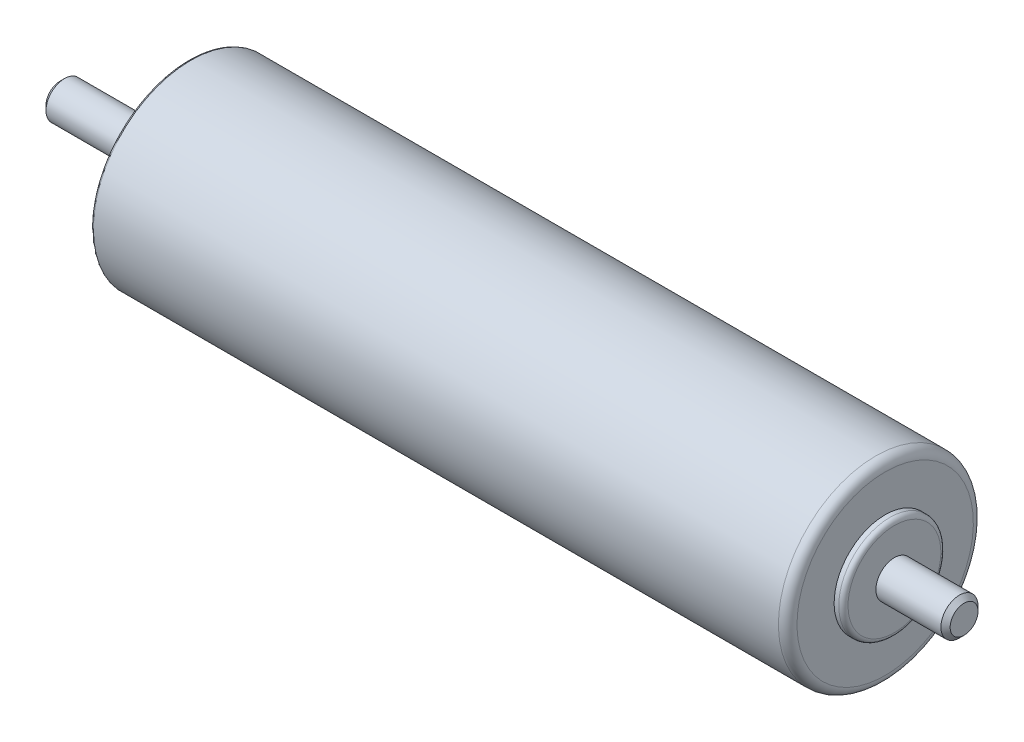
ISO-10303-21;
HEADER;
FILE_DESCRIPTION(('STEP AP214'),'2;1');
FILE_NAME('part.step','',(''),(''),'','','');
FILE_SCHEMA(('AUTOMOTIVE_DESIGN { 1 0 10303 214 1 1 1 1 }'));
ENDSEC;
DATA;
#1=APPLICATION_CONTEXT('core data for automotive mechanical design processes');
#2=APPLICATION_PROTOCOL_DEFINITION('international standard','automotive_design',2000,#1);
#3=PRODUCT_CONTEXT('',#1,'mechanical');
#4=PRODUCT('Part','Part','',(#3));
#5=PRODUCT_RELATED_PRODUCT_CATEGORY('part','',(#4));
#6=PRODUCT_DEFINITION_FORMATION('','',#4);
#7=PRODUCT_DEFINITION_CONTEXT('part definition',#1,'design');
#8=PRODUCT_DEFINITION('design','',#6,#7);
#9=PRODUCT_DEFINITION_SHAPE('','',#8);
#10=(LENGTH_UNIT() NAMED_UNIT(*) SI_UNIT(.MILLI.,.METRE.));
#11=(NAMED_UNIT(*) PLANE_ANGLE_UNIT() SI_UNIT($,.RADIAN.));
#12=(NAMED_UNIT(*) SI_UNIT($,.STERADIAN.) SOLID_ANGLE_UNIT());
#13=UNCERTAINTY_MEASURE_WITH_UNIT(LENGTH_MEASURE(1.E-05),#10,'distance_accuracy_value','');
#14=(GEOMETRIC_REPRESENTATION_CONTEXT(3) GLOBAL_UNCERTAINTY_ASSIGNED_CONTEXT((#13)) GLOBAL_UNIT_ASSIGNED_CONTEXT((#10,
#11,#12)) REPRESENTATION_CONTEXT('',''));
#15=CARTESIAN_POINT('',(0.,0.,0.));
#16=DIRECTION('',(0.,0.,1.));
#17=DIRECTION('',(1.,0.,0.));
#18=AXIS2_PLACEMENT_3D('',#15,#16,#17);
#19=CARTESIAN_POINT('',(0.,0.,0.));
#20=DIRECTION('',(-1.,0.,0.));
#21=DIRECTION('',(0.,-1.,0.));
#22=AXIS2_PLACEMENT_3D('',#19,#20,#21);
#23=PLANE('',#22);
#24=CARTESIAN_POINT('',(0.,0.,0.));
#25=DIRECTION('',(-1.,0.,0.));
#26=DIRECTION('',(0.,-1.,0.));
#27=AXIS2_PLACEMENT_3D('',#24,#25,#26);
#28=CIRCLE('',#27,3.);
#29=CARTESIAN_POINT('',(0.,-3.,0.));
#30=VERTEX_POINT('',#29);
#31=EDGE_CURVE('E159',#30,#30,#28,.T.);
#32=ORIENTED_EDGE('',*,*,#31,.T.);
#33=EDGE_LOOP('',(#32));
#34=FACE_BOUND('',#33,.T.);
#35=ADVANCED_FACE('F36',(#34),#23,.T.);
#36=CARTESIAN_POINT('',(194.8,0.,0.));
#37=DIRECTION('',(1.,0.,0.));
#38=DIRECTION('',(0.,1.,0.));
#39=AXIS2_PLACEMENT_3D('',#36,#37,#38);
#40=CYLINDRICAL_SURFACE('',#39,3.99999999999998);
#41=CARTESIAN_POINT('',(0.999999999999945,0.,0.));
#42=DIRECTION('',(-1.,0.,0.));
#43=DIRECTION('',(0.,-1.,0.));
#44=AXIS2_PLACEMENT_3D('',#41,#42,#43);
#45=CIRCLE('',#44,3.99999999999998);
#46=CARTESIAN_POINT('',(0.999999999999946,-3.99999999999998,0.));
#47=VERTEX_POINT('',#46);
#48=EDGE_CURVE('E156',#47,#47,#45,.F.);
#49=ORIENTED_EDGE('',*,*,#48,.T.);
#50=EDGE_LOOP('',(#49));
#51=FACE_BOUND('',#50,.T.);
#52=CARTESIAN_POINT('',(25.,0.,0.));
#53=DIRECTION('',(1.,0.,0.));
#54=DIRECTION('',(0.,1.,0.));
#55=AXIS2_PLACEMENT_3D('',#52,#53,#54);
#56=CIRCLE('',#55,3.99999999999997);
#57=CARTESIAN_POINT('',(25.,3.99999999999998,0.));
#58=VERTEX_POINT('',#57);
#59=EDGE_CURVE('E135',#58,#58,#56,.T.);
#60=ORIENTED_EDGE('',*,*,#59,.F.);
#61=EDGE_LOOP('',(#60));
#62=FACE_BOUND('',#61,.T.);
#63=ADVANCED_FACE('F189',(#51,#62),#40,.T.);
#64=CARTESIAN_POINT('',(25.,3.99999999999998,0.));
#65=DIRECTION('',(-1.,0.,0.));
#66=DIRECTION('',(0.,-1.,0.));
#67=AXIS2_PLACEMENT_3D('',#64,#65,#66);
#68=PLANE('',#67);
#69=CARTESIAN_POINT('',(25.,0.,0.));
#70=DIRECTION('',(-1.,0.,0.));
#71=DIRECTION('',(0.,-1.,0.));
#72=AXIS2_PLACEMENT_3D('',#69,#70,#71);
#73=CIRCLE('',#72,11.5);
#74=CARTESIAN_POINT('',(25.,-11.5,0.));
#75=VERTEX_POINT('',#74);
#76=EDGE_CURVE('E147',#75,#75,#73,.T.);
#77=ORIENTED_EDGE('',*,*,#76,.T.);
#78=EDGE_LOOP('',(#77));
#79=FACE_BOUND('',#78,.T.);
#80=ORIENTED_EDGE('',*,*,#59,.T.);
#81=EDGE_LOOP('',(#80));
#82=FACE_BOUND('',#81,.T.);
#83=ADVANCED_FACE('F195',(#79,#82),#68,.T.);
#84=CARTESIAN_POINT('',(194.8,0.,0.));
#85=DIRECTION('',(1.,0.,0.));
#86=DIRECTION('',(0.,1.,0.));
#87=AXIS2_PLACEMENT_3D('',#84,#85,#86);
#88=CYLINDRICAL_SURFACE('',#87,12.5);
#89=CARTESIAN_POINT('',(26.,0.,0.));
#90=DIRECTION('',(-1.,0.,0.));
#91=DIRECTION('',(0.,-1.,0.));
#92=AXIS2_PLACEMENT_3D('',#89,#90,#91);
#93=CIRCLE('',#92,12.5);
#94=CARTESIAN_POINT('',(26.,-12.5,0.));
#95=VERTEX_POINT('',#94);
#96=EDGE_CURVE('E144',#95,#95,#93,.F.);
#97=ORIENTED_EDGE('',*,*,#96,.T.);
#98=EDGE_LOOP('',(#97));
#99=FACE_BOUND('',#98,.T.);
#100=CARTESIAN_POINT('',(27.8,0.,0.));
#101=DIRECTION('',(1.,0.,0.));
#102=DIRECTION('',(0.,1.,0.));
#103=AXIS2_PLACEMENT_3D('',#100,#101,#102);
#104=CIRCLE('',#103,12.5);
#105=CARTESIAN_POINT('',(27.8,12.5,0.));
#106=VERTEX_POINT('',#105);
#107=EDGE_CURVE('E132',#106,#106,#104,.T.);
#108=ORIENTED_EDGE('',*,*,#107,.F.);
#109=EDGE_LOOP('',(#108));
#110=FACE_BOUND('',#109,.T.);
#111=ADVANCED_FACE('F256',(#99,#110),#88,.T.);
#112=CARTESIAN_POINT('',(27.8,12.5,0.));
#113=DIRECTION('',(-1.,0.,0.));
#114=DIRECTION('',(0.,-1.,0.));
#115=AXIS2_PLACEMENT_3D('',#112,#113,#114);
#116=PLANE('',#115);
#117=CARTESIAN_POINT('',(27.8,12.5289813198397,12.9238007988017));
#118=DIRECTION('',(-1.,0.,0.));
#119=DIRECTION('',(0.,0.,1.));
#120=AXIS2_PLACEMENT_3D('',#117,#118,#119);
#121=CIRCLE('',#120,1.64999999999999);
#122=CARTESIAN_POINT('',(27.8,12.5289813198397,14.5738007988017));
#123=VERTEX_POINT('',#122);
#124=EDGE_CURVE('E80',#123,#123,#121,.T.);
#125=ORIENTED_EDGE('',*,*,#124,.F.);
#126=EDGE_LOOP('',(#125));
#127=FACE_BOUND('',#126,.T.);
#128=CARTESIAN_POINT('',(27.8,12.9238007988016,-12.5289813198398));
#129=DIRECTION('',(-1.,0.,0.));
#130=DIRECTION('',(0.,0.,1.));
#131=AXIS2_PLACEMENT_3D('',#128,#129,#130);
#132=CIRCLE('',#131,1.64999999999999);
#133=CARTESIAN_POINT('',(27.8,12.9238007988016,-10.8789813198398));
#134=VERTEX_POINT('',#133);
#135=EDGE_CURVE('E79',#134,#134,#132,.T.);
#136=ORIENTED_EDGE('',*,*,#135,.F.);
#137=EDGE_LOOP('',(#136));
#138=FACE_BOUND('',#137,.T.);
#139=CARTESIAN_POINT('',(27.8,-12.5289813198398,-12.9238007988016));
#140=DIRECTION('',(-1.,0.,0.));
#141=DIRECTION('',(0.,0.,1.));
#142=AXIS2_PLACEMENT_3D('',#139,#140,#141);
#143=CIRCLE('',#142,1.64999999999999);
#144=CARTESIAN_POINT('',(27.8,-12.5289813198398,-11.2738007988016));
#145=VERTEX_POINT('',#144);
#146=EDGE_CURVE('E90',#145,#145,#143,.T.);
#147=ORIENTED_EDGE('',*,*,#146,.F.);
#148=EDGE_LOOP('',(#147));
#149=FACE_BOUND('',#148,.T.);
#150=CARTESIAN_POINT('',(27.8,-12.9238007988016,12.5289813198398));
#151=DIRECTION('',(-1.,0.,0.));
#152=DIRECTION('',(0.,0.,1.));
#153=AXIS2_PLACEMENT_3D('',#150,#151,#152);
#154=CIRCLE('',#153,1.64999999999999);
#155=CARTESIAN_POINT('',(27.8,-12.9238007988016,14.1789813198398));
#156=VERTEX_POINT('',#155);
#157=EDGE_CURVE('E96',#156,#156,#154,.T.);
#158=ORIENTED_EDGE('',*,*,#157,.F.);
#159=EDGE_LOOP('',(#158));
#160=FACE_BOUND('',#159,.T.);
#161=CARTESIAN_POINT('',(27.8,0.,0.));
#162=DIRECTION('',(-1.,0.,0.));
#163=DIRECTION('',(0.,-1.,0.));
#164=AXIS2_PLACEMENT_3D('',#161,#162,#163);
#165=CIRCLE('',#164,20.6);
#166=CARTESIAN_POINT('',(27.8,-20.6,0.));
#167=VERTEX_POINT('',#166);
#168=EDGE_CURVE('E11',#167,#167,#165,.T.);
#169=ORIENTED_EDGE('',*,*,#168,.T.);
#170=EDGE_LOOP('',(#169));
#171=FACE_BOUND('',#170,.T.);
#172=CARTESIAN_POINT('',(27.8,16.,0.248189436971811));
#173=DIRECTION('',(-1.,0.,0.));
#174=DIRECTION('',(0.,0.,1.));
#175=AXIS2_PLACEMENT_3D('',#172,#173,#174);
#176=CIRCLE('',#175,1.25);
#177=CARTESIAN_POINT('',(27.8,16.,1.49818943697181));
#178=VERTEX_POINT('',#177);
#179=EDGE_CURVE('E102',#178,#178,#176,.T.);
#180=ORIENTED_EDGE('',*,*,#179,.F.);
#181=EDGE_LOOP('',(#180));
#182=FACE_BOUND('',#181,.T.);
#183=CARTESIAN_POINT('',(27.8,0.248189436971645,-16.));
#184=DIRECTION('',(-1.,0.,0.));
#185=DIRECTION('',(0.,0.,1.));
#186=AXIS2_PLACEMENT_3D('',#183,#184,#185);
#187=CIRCLE('',#186,1.25);
#188=CARTESIAN_POINT('',(27.8,0.248189436971645,-14.75));
#189=VERTEX_POINT('',#188);
#190=EDGE_CURVE('E108',#189,#189,#187,.T.);
#191=ORIENTED_EDGE('',*,*,#190,.F.);
#192=EDGE_LOOP('',(#191));
#193=FACE_BOUND('',#192,.T.);
#194=CARTESIAN_POINT('',(27.8,-16.,-0.248189436971699));
#195=DIRECTION('',(-1.,0.,0.));
#196=DIRECTION('',(0.,0.,1.));
#197=AXIS2_PLACEMENT_3D('',#194,#195,#196);
#198=CIRCLE('',#197,1.25);
#199=CARTESIAN_POINT('',(27.8,-16.,1.0018105630283));
#200=VERTEX_POINT('',#199);
#201=EDGE_CURVE('E114',#200,#200,#198,.T.);
#202=ORIENTED_EDGE('',*,*,#201,.F.);
#203=EDGE_LOOP('',(#202));
#204=FACE_BOUND('',#203,.T.);
#205=CARTESIAN_POINT('',(27.8,-0.248189436971642,16.));
#206=DIRECTION('',(-1.,0.,0.));
#207=DIRECTION('',(0.,0.,1.));
#208=AXIS2_PLACEMENT_3D('',#205,#206,#207);
#209=CIRCLE('',#208,1.25);
#210=CARTESIAN_POINT('',(27.8,-0.248189436971642,17.25));
#211=VERTEX_POINT('',#210);
#212=EDGE_CURVE('E120',#211,#211,#209,.T.);
#213=ORIENTED_EDGE('',*,*,#212,.F.);
#214=EDGE_LOOP('',(#213));
#215=FACE_BOUND('',#214,.T.);
#216=ORIENTED_EDGE('',*,*,#107,.T.);
#217=EDGE_LOOP('',(#216));
#218=FACE_BOUND('',#217,.T.);
#219=ADVANCED_FACE('F253',(#127,#138,#149,#160,#171,#182,#193,#204,#215,#218),#116,.T.);
#220=CARTESIAN_POINT('',(194.8,0.,0.));
#221=DIRECTION('',(1.,0.,0.));
#222=DIRECTION('',(0.,1.,0.));
#223=AXIS2_PLACEMENT_3D('',#220,#221,#222);
#224=CYLINDRICAL_SURFACE('',#223,21.);
#225=CARTESIAN_POINT('',(28.2,0.,0.));
#226=DIRECTION('',(-1.,0.,0.));
#227=DIRECTION('',(0.,-1.,0.));
#228=AXIS2_PLACEMENT_3D('',#225,#226,#227);
#229=CIRCLE('',#228,21.);
#230=CARTESIAN_POINT('',(28.2,-21.,0.));
#231=VERTEX_POINT('',#230);
#232=EDGE_CURVE('E44',#231,#231,#229,.F.);
#233=ORIENTED_EDGE('',*,*,#232,.T.);
#234=EDGE_LOOP('',(#233));
#235=FACE_BOUND('',#234,.T.);
#236=CARTESIAN_POINT('',(175.8,0.,0.));
#237=DIRECTION('',(1.,0.,0.));
#238=DIRECTION('',(0.,1.,0.));
#239=AXIS2_PLACEMENT_3D('',#236,#237,#238);
#240=CIRCLE('',#239,21.);
#241=CARTESIAN_POINT('',(175.8,21.,0.));
#242=VERTEX_POINT('',#241);
#243=EDGE_CURVE('E141',#242,#242,#240,.F.);
#244=ORIENTED_EDGE('',*,*,#243,.T.);
#245=EDGE_LOOP('',(#244));
#246=FACE_BOUND('',#245,.T.);
#247=ADVANCED_FACE('F170',(#235,#246),#224,.T.);
#248=CARTESIAN_POINT('',(177.8,21.,0.));
#249=DIRECTION('',(1.,0.,0.));
#250=DIRECTION('',(0.,1.,0.));
#251=AXIS2_PLACEMENT_3D('',#248,#249,#250);
#252=PLANE('',#251);
#253=CARTESIAN_POINT('',(177.8,0.,0.));
#254=DIRECTION('',(1.,0.,0.));
#255=DIRECTION('',(0.,1.,0.));
#256=AXIS2_PLACEMENT_3D('',#253,#254,#255);
#257=CIRCLE('',#256,19.);
#258=CARTESIAN_POINT('',(177.8,19.,0.));
#259=VERTEX_POINT('',#258);
#260=EDGE_CURVE('E138',#259,#259,#257,.T.);
#261=ORIENTED_EDGE('',*,*,#260,.T.);
#262=EDGE_LOOP('',(#261));
#263=FACE_BOUND('',#262,.T.);
#264=CARTESIAN_POINT('',(177.8,0.,0.));
#265=DIRECTION('',(1.,0.,0.));
#266=DIRECTION('',(0.,1.,0.));
#267=AXIS2_PLACEMENT_3D('',#264,#265,#266);
#268=CIRCLE('',#267,11.);
#269=CARTESIAN_POINT('',(177.8,11.,0.));
#270=VERTEX_POINT('',#269);
#271=EDGE_CURVE('E129',#270,#270,#268,.T.);
#272=ORIENTED_EDGE('',*,*,#271,.F.);
#273=EDGE_LOOP('',(#272));
#274=FACE_BOUND('',#273,.T.);
#275=ADVANCED_FACE('F246',(#263,#274),#252,.T.);
#276=CARTESIAN_POINT('',(194.8,0.,0.));
#277=DIRECTION('',(1.,0.,0.));
#278=DIRECTION('',(0.,1.,0.));
#279=AXIS2_PLACEMENT_3D('',#276,#277,#278);
#280=CYLINDRICAL_SURFACE('',#279,11.);
#281=CARTESIAN_POINT('',(178.8,0.,0.));
#282=DIRECTION('',(1.,0.,0.));
#283=DIRECTION('',(0.,1.,0.));
#284=AXIS2_PLACEMENT_3D('',#281,#282,#283);
#285=CIRCLE('',#284,11.);
#286=CARTESIAN_POINT('',(178.8,11.,0.));
#287=VERTEX_POINT('',#286);
#288=EDGE_CURVE('E153',#287,#287,#285,.F.);
#289=ORIENTED_EDGE('',*,*,#288,.T.);
#290=EDGE_LOOP('',(#289));
#291=FACE_BOUND('',#290,.T.);
#292=ORIENTED_EDGE('',*,*,#271,.T.);
#293=EDGE_LOOP('',(#292));
#294=FACE_BOUND('',#293,.T.);
#295=ADVANCED_FACE('F242',(#291,#294),#280,.T.);
#296=CARTESIAN_POINT('',(179.8,11.,0.));
#297=DIRECTION('',(1.,0.,0.));
#298=DIRECTION('',(0.,1.,0.));
#299=AXIS2_PLACEMENT_3D('',#296,#297,#298);
#300=PLANE('',#299);
#301=CARTESIAN_POINT('',(179.8,0.,0.));
#302=DIRECTION('',(1.,0.,0.));
#303=DIRECTION('',(0.,1.,0.));
#304=AXIS2_PLACEMENT_3D('',#301,#302,#303);
#305=CIRCLE('',#304,9.99999999999999);
#306=CARTESIAN_POINT('',(179.8,10.,0.));
#307=VERTEX_POINT('',#306);
#308=EDGE_CURVE('E150',#307,#307,#305,.T.);
#309=ORIENTED_EDGE('',*,*,#308,.T.);
#310=EDGE_LOOP('',(#309));
#311=FACE_BOUND('',#310,.T.);
#312=CARTESIAN_POINT('',(179.8,0.,0.));
#313=DIRECTION('',(1.,0.,0.));
#314=DIRECTION('',(0.,1.,0.));
#315=AXIS2_PLACEMENT_3D('',#312,#313,#314);
#316=CIRCLE('',#315,3.99999999999999);
#317=CARTESIAN_POINT('',(179.8,4.,0.));
#318=VERTEX_POINT('',#317);
#319=EDGE_CURVE('E126',#318,#318,#316,.T.);
#320=ORIENTED_EDGE('',*,*,#319,.F.);
#321=EDGE_LOOP('',(#320));
#322=FACE_BOUND('',#321,.T.);
#323=ADVANCED_FACE('F235',(#311,#322),#300,.T.);
#324=CARTESIAN_POINT('',(194.8,0.,0.));
#325=DIRECTION('',(1.,0.,0.));
#326=DIRECTION('',(0.,1.,0.));
#327=AXIS2_PLACEMENT_3D('',#324,#325,#326);
#328=CYLINDRICAL_SURFACE('',#327,3.99999999999999);
#329=CARTESIAN_POINT('',(193.8,0.,0.));
#330=DIRECTION('',(1.,0.,0.));
#331=DIRECTION('',(0.,1.,0.));
#332=AXIS2_PLACEMENT_3D('',#329,#330,#331);
#333=CIRCLE('',#332,3.99999999999999);
#334=CARTESIAN_POINT('',(193.8,4.,0.));
#335=VERTEX_POINT('',#334);
#336=EDGE_CURVE('E165',#335,#335,#333,.F.);
#337=ORIENTED_EDGE('',*,*,#336,.T.);
#338=EDGE_LOOP('',(#337));
#339=FACE_BOUND('',#338,.T.);
#340=ORIENTED_EDGE('',*,*,#319,.T.);
#341=EDGE_LOOP('',(#340));
#342=FACE_BOUND('',#341,.T.);
#343=ADVANCED_FACE('F230',(#339,#342),#328,.T.);
#344=CARTESIAN_POINT('',(194.8,4.,0.));
#345=DIRECTION('',(1.,0.,0.));
#346=DIRECTION('',(0.,1.,0.));
#347=AXIS2_PLACEMENT_3D('',#344,#345,#346);
#348=PLANE('',#347);
#349=CARTESIAN_POINT('',(194.8,0.,0.));
#350=DIRECTION('',(1.,0.,0.));
#351=DIRECTION('',(0.,1.,0.));
#352=AXIS2_PLACEMENT_3D('',#349,#350,#351);
#353=CIRCLE('',#352,2.99999999999995);
#354=CARTESIAN_POINT('',(194.8,2.99999999999996,0.));
#355=VERTEX_POINT('',#354);
#356=EDGE_CURVE('E162',#355,#355,#353,.T.);
#357=ORIENTED_EDGE('',*,*,#356,.T.);
#358=EDGE_LOOP('',(#357));
#359=FACE_BOUND('',#358,.T.);
#360=ADVANCED_FACE('F204',(#359),#348,.T.);
#361=CARTESIAN_POINT('',(175.8,0.,0.));
#362=DIRECTION('',(1.,0.,0.));
#363=DIRECTION('',(0.,1.,0.));
#364=AXIS2_PLACEMENT_3D('',#361,#362,#363);
#365=TOROIDAL_SURFACE('',#364,19.,2.);
#366=ORIENTED_EDGE('',*,*,#243,.F.);
#367=EDGE_LOOP('',(#366));
#368=FACE_BOUND('',#367,.T.);
#369=ORIENTED_EDGE('',*,*,#260,.F.);
#370=EDGE_LOOP('',(#369));
#371=FACE_BOUND('',#370,.T.);
#372=ADVANCED_FACE('F200',(#368,#371),#365,.T.);
#373=CARTESIAN_POINT('',(26.,0.,0.));
#374=DIRECTION('',(-1.,0.,0.));
#375=DIRECTION('',(0.,-1.,0.));
#376=AXIS2_PLACEMENT_3D('',#373,#374,#375);
#377=TOROIDAL_SURFACE('',#376,11.5,1.);
#378=ORIENTED_EDGE('',*,*,#76,.F.);
#379=EDGE_LOOP('',(#378));
#380=FACE_BOUND('',#379,.T.);
#381=ORIENTED_EDGE('',*,*,#96,.F.);
#382=EDGE_LOOP('',(#381));
#383=FACE_BOUND('',#382,.T.);
#384=ADVANCED_FACE('F203',(#380,#383),#377,.T.);
#385=CARTESIAN_POINT('',(178.8,0.,0.));
#386=DIRECTION('',(1.,0.,0.));
#387=DIRECTION('',(0.,1.,0.));
#388=AXIS2_PLACEMENT_3D('',#385,#386,#387);
#389=TOROIDAL_SURFACE('',#388,9.99999999999999,1.);
#390=ORIENTED_EDGE('',*,*,#288,.F.);
#391=EDGE_LOOP('',(#390));
#392=FACE_BOUND('',#391,.T.);
#393=ORIENTED_EDGE('',*,*,#308,.F.);
#394=EDGE_LOOP('',(#393));
#395=FACE_BOUND('',#394,.T.);
#396=ADVANCED_FACE('F208',(#392,#395),#389,.T.);
#397=CARTESIAN_POINT('',(0.999999999999945,0.,0.));
#398=DIRECTION('',(1.,0.,0.));
#399=DIRECTION('',(0.,1.,0.));
#400=AXIS2_PLACEMENT_3D('',#397,#398,#399);
#401=CONICAL_SURFACE('',#400,3.99999999999998,0.785398163397462);
#402=ORIENTED_EDGE('',*,*,#31,.F.);
#403=EDGE_LOOP('',(#402));
#404=FACE_BOUND('',#403,.T.);
#405=ORIENTED_EDGE('',*,*,#48,.F.);
#406=EDGE_LOOP('',(#405));
#407=FACE_BOUND('',#406,.T.);
#408=ADVANCED_FACE('F212',(#404,#407),#401,.T.);
#409=CARTESIAN_POINT('',(194.8,0.,0.));
#410=DIRECTION('',(-1.,0.,0.));
#411=DIRECTION('',(0.,-1.,0.));
#412=AXIS2_PLACEMENT_3D('',#409,#410,#411);
#413=CONICAL_SURFACE('',#412,2.99999999999995,0.785398163397454);
#414=ORIENTED_EDGE('',*,*,#336,.F.);
#415=EDGE_LOOP('',(#414));
#416=FACE_BOUND('',#415,.T.);
#417=ORIENTED_EDGE('',*,*,#356,.F.);
#418=EDGE_LOOP('',(#417));
#419=FACE_BOUND('',#418,.T.);
#420=ADVANCED_FACE('F215',(#416,#419),#413,.T.);
#421=CARTESIAN_POINT('',(36.3,-0.248189436971642,16.));
#422=DIRECTION('',(-1.,0.,0.));
#423=DIRECTION('',(0.,0.,1.));
#424=AXIS2_PLACEMENT_3D('',#421,#422,#423);
#425=CONICAL_SURFACE('',#424,1.25,1.02974425867665);
#426=CARTESIAN_POINT('',(37.0510757737844,-0.248189436971644,16.));
#427=VERTEX_POINT('',#426);
#428=VERTEX_LOOP('',#427);
#429=FACE_BOUND('',#428,.T.);
#430=CARTESIAN_POINT('',(36.3,-0.248189436971642,16.));
#431=DIRECTION('',(-1.,0.,0.));
#432=DIRECTION('',(0.,0.,1.));
#433=AXIS2_PLACEMENT_3D('',#430,#431,#432);
#434=CIRCLE('',#433,1.25);
#435=CARTESIAN_POINT('',(36.3,-0.248189436971642,17.25));
#436=VERTEX_POINT('',#435);
#437=EDGE_CURVE('E123',#436,#436,#434,.T.);
#438=ORIENTED_EDGE('',*,*,#437,.T.);
#439=EDGE_LOOP('',(#438));
#440=FACE_BOUND('',#439,.T.);
#441=ADVANCED_FACE('F218',(#429,#440),#425,.F.);
#442=CARTESIAN_POINT('',(27.8,-0.248189436971642,16.));
#443=DIRECTION('',(-1.,0.,0.));
#444=DIRECTION('',(0.,0.,1.));
#445=AXIS2_PLACEMENT_3D('',#442,#443,#444);
#446=CYLINDRICAL_SURFACE('',#445,1.25);
#447=ORIENTED_EDGE('',*,*,#437,.F.);
#448=EDGE_LOOP('',(#447));
#449=FACE_BOUND('',#448,.T.);
#450=ORIENTED_EDGE('',*,*,#212,.T.);
#451=EDGE_LOOP('',(#450));
#452=FACE_BOUND('',#451,.T.);
#453=ADVANCED_FACE('F223',(#449,#452),#446,.F.);
#454=CARTESIAN_POINT('',(36.3,-16.,-0.248189436971699));
#455=DIRECTION('',(-1.,0.,0.));
#456=DIRECTION('',(0.,0.,1.));
#457=AXIS2_PLACEMENT_3D('',#454,#455,#456);
#458=CONICAL_SURFACE('',#457,1.25,1.02974425867665);
#459=CARTESIAN_POINT('',(37.0510757737844,-16.,-0.248189436971699));
#460=VERTEX_POINT('',#459);
#461=VERTEX_LOOP('',#460);
#462=FACE_BOUND('',#461,.T.);
#463=CARTESIAN_POINT('',(36.3,-16.,-0.248189436971699));
#464=DIRECTION('',(-1.,0.,0.));
#465=DIRECTION('',(0.,0.,1.));
#466=AXIS2_PLACEMENT_3D('',#463,#464,#465);
#467=CIRCLE('',#466,1.25);
#468=CARTESIAN_POINT('',(36.3,-16.,1.0018105630283));
#469=VERTEX_POINT('',#468);
#470=EDGE_CURVE('E117',#469,#469,#467,.T.);
#471=ORIENTED_EDGE('',*,*,#470,.T.);
#472=EDGE_LOOP('',(#471));
#473=FACE_BOUND('',#472,.T.);
#474=ADVANCED_FACE('F367',(#462,#473),#458,.F.);
#475=CARTESIAN_POINT('',(27.8,-16.,-0.248189436971699));
#476=DIRECTION('',(-1.,0.,0.));
#477=DIRECTION('',(0.,0.,1.));
#478=AXIS2_PLACEMENT_3D('',#475,#476,#477);
#479=CYLINDRICAL_SURFACE('',#478,1.25);
#480=ORIENTED_EDGE('',*,*,#470,.F.);
#481=EDGE_LOOP('',(#480));
#482=FACE_BOUND('',#481,.T.);
#483=ORIENTED_EDGE('',*,*,#201,.T.);
#484=EDGE_LOOP('',(#483));
#485=FACE_BOUND('',#484,.T.);
#486=ADVANCED_FACE('F376',(#482,#485),#479,.F.);
#487=CARTESIAN_POINT('',(36.3,0.248189436971645,-16.));
#488=DIRECTION('',(-1.,0.,0.));
#489=DIRECTION('',(0.,0.,1.));
#490=AXIS2_PLACEMENT_3D('',#487,#488,#489);
#491=CONICAL_SURFACE('',#490,1.25,1.02974425867665);
#492=CARTESIAN_POINT('',(37.0510757737844,0.248189436971643,-16.));
#493=VERTEX_POINT('',#492);
#494=VERTEX_LOOP('',#493);
#495=FACE_BOUND('',#494,.T.);
#496=CARTESIAN_POINT('',(36.3,0.248189436971645,-16.));
#497=DIRECTION('',(-1.,0.,0.));
#498=DIRECTION('',(0.,0.,1.));
#499=AXIS2_PLACEMENT_3D('',#496,#497,#498);
#500=CIRCLE('',#499,1.25);
#501=CARTESIAN_POINT('',(36.3,0.248189436971645,-14.75));
#502=VERTEX_POINT('',#501);
#503=EDGE_CURVE('E111',#502,#502,#500,.T.);
#504=ORIENTED_EDGE('',*,*,#503,.T.);
#505=EDGE_LOOP('',(#504));
#506=FACE_BOUND('',#505,.T.);
#507=ADVANCED_FACE('F384',(#495,#506),#491,.F.);
#508=CARTESIAN_POINT('',(27.8,0.248189436971645,-16.));
#509=DIRECTION('',(-1.,0.,0.));
#510=DIRECTION('',(0.,0.,1.));
#511=AXIS2_PLACEMENT_3D('',#508,#509,#510);
#512=CYLINDRICAL_SURFACE('',#511,1.25);
#513=ORIENTED_EDGE('',*,*,#503,.F.);
#514=EDGE_LOOP('',(#513));
#515=FACE_BOUND('',#514,.T.);
#516=ORIENTED_EDGE('',*,*,#190,.T.);
#517=EDGE_LOOP('',(#516));
#518=FACE_BOUND('',#517,.T.);
#519=ADVANCED_FACE('F394',(#515,#518),#512,.F.);
#520=CARTESIAN_POINT('',(36.3,16.,0.248189436971811));
#521=DIRECTION('',(-1.,0.,0.));
#522=DIRECTION('',(0.,0.,1.));
#523=AXIS2_PLACEMENT_3D('',#520,#521,#522);
#524=CONICAL_SURFACE('',#523,1.25,1.02974425867665);
#525=CARTESIAN_POINT('',(37.0510757737844,16.,0.248189436971811));
#526=VERTEX_POINT('',#525);
#527=VERTEX_LOOP('',#526);
#528=FACE_BOUND('',#527,.T.);
#529=CARTESIAN_POINT('',(36.3,16.,0.248189436971811));
#530=DIRECTION('',(-1.,0.,0.));
#531=DIRECTION('',(0.,0.,1.));
#532=AXIS2_PLACEMENT_3D('',#529,#530,#531);
#533=CIRCLE('',#532,1.25);
#534=CARTESIAN_POINT('',(36.3,16.,1.49818943697181));
#535=VERTEX_POINT('',#534);
#536=EDGE_CURVE('E105',#535,#535,#533,.T.);
#537=ORIENTED_EDGE('',*,*,#536,.T.);
#538=EDGE_LOOP('',(#537));
#539=FACE_BOUND('',#538,.T.);
#540=ADVANCED_FACE('F184',(#528,#539),#524,.F.);
#541=CARTESIAN_POINT('',(27.8,16.,0.248189436971811));
#542=DIRECTION('',(-1.,0.,0.));
#543=DIRECTION('',(0.,0.,1.));
#544=AXIS2_PLACEMENT_3D('',#541,#542,#543);
#545=CYLINDRICAL_SURFACE('',#544,1.25);
#546=ORIENTED_EDGE('',*,*,#536,.F.);
#547=EDGE_LOOP('',(#546));
#548=FACE_BOUND('',#547,.T.);
#549=ORIENTED_EDGE('',*,*,#179,.T.);
#550=EDGE_LOOP('',(#549));
#551=FACE_BOUND('',#550,.T.);
#552=ADVANCED_FACE('F175',(#548,#551),#545,.F.);
#553=CARTESIAN_POINT('',(28.2,0.,0.));
#554=DIRECTION('',(-1.,0.,0.));
#555=DIRECTION('',(0.,-1.,0.));
#556=AXIS2_PLACEMENT_3D('',#553,#554,#555);
#557=TOROIDAL_SURFACE('',#556,20.6,0.4);
#558=ORIENTED_EDGE('',*,*,#168,.F.);
#559=EDGE_LOOP('',(#558));
#560=FACE_BOUND('',#559,.T.);
#561=ORIENTED_EDGE('',*,*,#232,.F.);
#562=EDGE_LOOP('',(#561));
#563=FACE_BOUND('',#562,.T.);
#564=ADVANCED_FACE('F38',(#560,#563),#557,.T.);
#565=CARTESIAN_POINT('',(40.3,-12.9238007988016,12.5289813198398));
#566=DIRECTION('',(-1.,0.,0.));
#567=DIRECTION('',(0.,0.,1.));
#568=AXIS2_PLACEMENT_3D('',#565,#566,#567);
#569=CONICAL_SURFACE('',#568,1.64999999999999,1.02974425867665);
#570=CARTESIAN_POINT('',(41.2914200213955,-12.9238007988016,12.5289813198398));
#571=VERTEX_POINT('',#570);
#572=VERTEX_LOOP('',#571);
#573=FACE_BOUND('',#572,.T.);
#574=CARTESIAN_POINT('',(40.3,-12.9238007988016,12.5289813198398));
#575=DIRECTION('',(-1.,0.,0.));
#576=DIRECTION('',(0.,0.,1.));
#577=AXIS2_PLACEMENT_3D('',#574,#575,#576);
#578=CIRCLE('',#577,1.64999999999999);
#579=CARTESIAN_POINT('',(40.3,-12.9238007988016,14.1789813198398));
#580=VERTEX_POINT('',#579);
#581=EDGE_CURVE('E99',#580,#580,#578,.T.);
#582=ORIENTED_EDGE('',*,*,#581,.T.);
#583=EDGE_LOOP('',(#582));
#584=FACE_BOUND('',#583,.T.);
#585=ADVANCED_FACE('F174',(#573,#584),#569,.F.);
#586=CARTESIAN_POINT('',(27.8,-12.9238007988016,12.5289813198398));
#587=DIRECTION('',(-1.,0.,0.));
#588=DIRECTION('',(0.,0.,1.));
#589=AXIS2_PLACEMENT_3D('',#586,#587,#588);
#590=CYLINDRICAL_SURFACE('',#589,1.64999999999999);
#591=ORIENTED_EDGE('',*,*,#581,.F.);
#592=EDGE_LOOP('',(#591));
#593=FACE_BOUND('',#592,.T.);
#594=ORIENTED_EDGE('',*,*,#157,.T.);
#595=EDGE_LOOP('',(#594));
#596=FACE_BOUND('',#595,.T.);
#597=ADVANCED_FACE('F181',(#593,#596),#590,.F.);
#598=CARTESIAN_POINT('',(40.3,-12.5289813198398,-12.9238007988016));
#599=DIRECTION('',(-1.,0.,0.));
#600=DIRECTION('',(0.,0.,1.));
#601=AXIS2_PLACEMENT_3D('',#598,#599,#600);
#602=CONICAL_SURFACE('',#601,1.64999999999999,1.02974425867665);
#603=CARTESIAN_POINT('',(41.2914200213955,-12.5289813198398,-12.9238007988016));
#604=VERTEX_POINT('',#603);
#605=VERTEX_LOOP('',#604);
#606=FACE_BOUND('',#605,.T.);
#607=CARTESIAN_POINT('',(40.3,-12.5289813198398,-12.9238007988016));
#608=DIRECTION('',(-1.,0.,0.));
#609=DIRECTION('',(0.,0.,1.));
#610=AXIS2_PLACEMENT_3D('',#607,#608,#609);
#611=CIRCLE('',#610,1.64999999999999);
#612=CARTESIAN_POINT('',(40.3,-12.5289813198398,-11.2738007988016));
#613=VERTEX_POINT('',#612);
#614=EDGE_CURVE('E93',#613,#613,#611,.T.);
#615=ORIENTED_EDGE('',*,*,#614,.T.);
#616=EDGE_LOOP('',(#615));
#617=FACE_BOUND('',#616,.T.);
#618=ADVANCED_FACE('F433',(#606,#617),#602,.F.);
#619=CARTESIAN_POINT('',(27.8,-12.5289813198398,-12.9238007988016));
#620=DIRECTION('',(-1.,0.,0.));
#621=DIRECTION('',(0.,0.,1.));
#622=AXIS2_PLACEMENT_3D('',#619,#620,#621);
#623=CYLINDRICAL_SURFACE('',#622,1.64999999999999);
#624=ORIENTED_EDGE('',*,*,#614,.F.);
#625=EDGE_LOOP('',(#624));
#626=FACE_BOUND('',#625,.T.);
#627=ORIENTED_EDGE('',*,*,#146,.T.);
#628=EDGE_LOOP('',(#627));
#629=FACE_BOUND('',#628,.T.);
#630=ADVANCED_FACE('F441',(#626,#629),#623,.F.);
#631=CARTESIAN_POINT('',(40.3,12.9238007988016,-12.5289813198398));
#632=DIRECTION('',(-1.,0.,0.));
#633=DIRECTION('',(0.,0.,1.));
#634=AXIS2_PLACEMENT_3D('',#631,#632,#633);
#635=CONICAL_SURFACE('',#634,1.64999999999999,1.02974425867665);
#636=CARTESIAN_POINT('',(41.2914200213955,12.9238007988016,-12.5289813198398));
#637=VERTEX_POINT('',#636);
#638=VERTEX_LOOP('',#637);
#639=FACE_BOUND('',#638,.T.);
#640=CARTESIAN_POINT('',(40.3,12.9238007988016,-12.5289813198398));
#641=DIRECTION('',(-1.,0.,0.));
#642=DIRECTION('',(0.,0.,1.));
#643=AXIS2_PLACEMENT_3D('',#640,#641,#642);
#644=CIRCLE('',#643,1.64999999999999);
#645=CARTESIAN_POINT('',(40.3,12.9238007988016,-10.8789813198398));
#646=VERTEX_POINT('',#645);
#647=EDGE_CURVE('E83',#646,#646,#644,.T.);
#648=ORIENTED_EDGE('',*,*,#647,.T.);
#649=EDGE_LOOP('',(#648));
#650=FACE_BOUND('',#649,.T.);
#651=ADVANCED_FACE('F450',(#639,#650),#635,.F.);
#652=CARTESIAN_POINT('',(27.8,12.9238007988016,-12.5289813198398));
#653=DIRECTION('',(-1.,0.,0.));
#654=DIRECTION('',(0.,0.,1.));
#655=AXIS2_PLACEMENT_3D('',#652,#653,#654);
#656=CYLINDRICAL_SURFACE('',#655,1.64999999999999);
#657=ORIENTED_EDGE('',*,*,#647,.F.);
#658=EDGE_LOOP('',(#657));
#659=FACE_BOUND('',#658,.T.);
#660=ORIENTED_EDGE('',*,*,#135,.T.);
#661=EDGE_LOOP('',(#660));
#662=FACE_BOUND('',#661,.T.);
#663=ADVANCED_FACE('F73',(#659,#662),#656,.F.);
#664=CARTESIAN_POINT('',(40.3,12.5289813198397,12.9238007988017));
#665=DIRECTION('',(-1.,0.,0.));
#666=DIRECTION('',(0.,0.,1.));
#667=AXIS2_PLACEMENT_3D('',#664,#665,#666);
#668=CONICAL_SURFACE('',#667,1.64999999999999,1.02974425867665);
#669=CARTESIAN_POINT('',(41.2914200213955,12.5289813198397,12.9238007988017));
#670=VERTEX_POINT('',#669);
#671=VERTEX_LOOP('',#670);
#672=FACE_BOUND('',#671,.T.);
#673=CARTESIAN_POINT('',(40.3,12.5289813198397,12.9238007988017));
#674=DIRECTION('',(-1.,0.,0.));
#675=DIRECTION('',(0.,0.,1.));
#676=AXIS2_PLACEMENT_3D('',#673,#674,#675);
#677=CIRCLE('',#676,1.64999999999999);
#678=CARTESIAN_POINT('',(40.3,12.5289813198397,14.5738007988017));
#679=VERTEX_POINT('',#678);
#680=EDGE_CURVE('E77',#679,#679,#677,.T.);
#681=ORIENTED_EDGE('',*,*,#680,.T.);
#682=EDGE_LOOP('',(#681));
#683=FACE_BOUND('',#682,.T.);
#684=ADVANCED_FACE('F69',(#672,#683),#668,.F.);
#685=CARTESIAN_POINT('',(27.8,12.5289813198397,12.9238007988017));
#686=DIRECTION('',(-1.,0.,0.));
#687=DIRECTION('',(0.,0.,1.));
#688=AXIS2_PLACEMENT_3D('',#685,#686,#687);
#689=CYLINDRICAL_SURFACE('',#688,1.64999999999999);
#690=ORIENTED_EDGE('',*,*,#680,.F.);
#691=EDGE_LOOP('',(#690));
#692=FACE_BOUND('',#691,.T.);
#693=ORIENTED_EDGE('',*,*,#124,.T.);
#694=EDGE_LOOP('',(#693));
#695=FACE_BOUND('',#694,.T.);
#696=ADVANCED_FACE('F72',(#692,#695),#689,.F.);
#697=CLOSED_SHELL('',(#35,#63,#83,#111,#219,#247,#275,#295,#323,#343,#360,#372,#384,#396,#408,
#420,#441,#453,#474,#486,#507,#519,#540,#552,#564,#585,#597,#618,#630,#651,#663,#684,#696));
#698=MANIFOLD_SOLID_BREP('B2',#697);
#699=ADVANCED_BREP_SHAPE_REPRESENTATION('',(#18,#698),#14);
#700=SHAPE_DEFINITION_REPRESENTATION(#9,#699);
ENDSEC;
END-ISO-10303-21;
